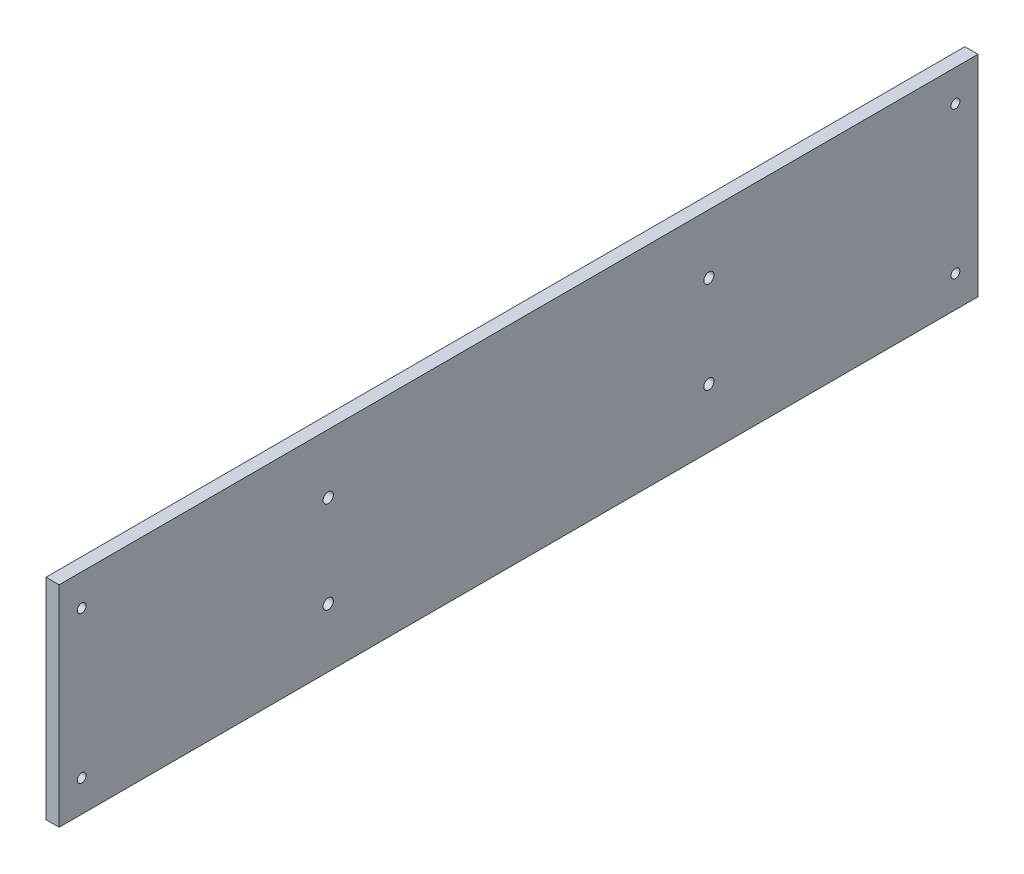
ISO-10303-21;
HEADER;
FILE_DESCRIPTION(('STEP AP214'),'2;1');
FILE_NAME('part.step','',(''),(''),'','','');
FILE_SCHEMA(('AUTOMOTIVE_DESIGN { 1 0 10303 214 1 1 1 1 }'));
ENDSEC;
DATA;
#1=APPLICATION_CONTEXT('core data for automotive mechanical design processes');
#2=APPLICATION_PROTOCOL_DEFINITION('international standard','automotive_design',2000,#1);
#3=PRODUCT_CONTEXT('',#1,'mechanical');
#4=PRODUCT('Part','Part','',(#3));
#5=PRODUCT_RELATED_PRODUCT_CATEGORY('part','',(#4));
#6=PRODUCT_DEFINITION_FORMATION('','',#4);
#7=PRODUCT_DEFINITION_CONTEXT('part definition',#1,'design');
#8=PRODUCT_DEFINITION('design','',#6,#7);
#9=PRODUCT_DEFINITION_SHAPE('','',#8);
#10=(LENGTH_UNIT() NAMED_UNIT(*) SI_UNIT(.MILLI.,.METRE.));
#11=(NAMED_UNIT(*) PLANE_ANGLE_UNIT() SI_UNIT($,.RADIAN.));
#12=(NAMED_UNIT(*) SI_UNIT($,.STERADIAN.) SOLID_ANGLE_UNIT());
#13=UNCERTAINTY_MEASURE_WITH_UNIT(LENGTH_MEASURE(1.E-05),#10,'distance_accuracy_value','');
#14=(GEOMETRIC_REPRESENTATION_CONTEXT(3) GLOBAL_UNCERTAINTY_ASSIGNED_CONTEXT((#13)) GLOBAL_UNIT_ASSIGNED_CONTEXT((#10,
#11,#12)) REPRESENTATION_CONTEXT('',''));
#15=CARTESIAN_POINT('',(0.,0.,0.));
#16=DIRECTION('',(0.,0.,1.));
#17=DIRECTION('',(1.,0.,0.));
#18=AXIS2_PLACEMENT_3D('',#15,#16,#17);
#19=CARTESIAN_POINT('',(6.35,50.8,-222.25));
#20=DIRECTION('',(0.,0.,1.));
#21=DIRECTION('',(1.,0.,0.));
#22=AXIS2_PLACEMENT_3D('',#19,#20,#21);
#23=PLANE('',#22);
#24=DIRECTION('',(0.,1.,0.));
#25=VECTOR('',#24,1.);
#26=CARTESIAN_POINT('',(0.,50.8,-222.25));
#27=LINE('',#26,#25);
#28=CARTESIAN_POINT('',(0.,-50.8,-222.25));
#29=VERTEX_POINT('',#28);
#30=CARTESIAN_POINT('',(0.,50.8,-222.25));
#31=VERTEX_POINT('',#30);
#32=EDGE_CURVE('E100',#29,#31,#27,.T.);
#33=ORIENTED_EDGE('',*,*,#32,.T.);
#34=DIRECTION('',(-1.,0.,0.));
#35=VECTOR('',#34,1.);
#36=CARTESIAN_POINT('',(6.35,50.8,-222.25));
#37=LINE('',#36,#35);
#38=CARTESIAN_POINT('',(6.35,50.8,-222.25));
#39=VERTEX_POINT('',#38);
#40=EDGE_CURVE('E11',#39,#31,#37,.T.);
#41=ORIENTED_EDGE('',*,*,#40,.F.);
#42=DIRECTION('',(0.,1.,0.));
#43=VECTOR('',#42,1.);
#44=CARTESIAN_POINT('',(6.35,50.8,-222.25));
#45=LINE('',#44,#43);
#46=CARTESIAN_POINT('',(6.35,-50.8,-222.25));
#47=VERTEX_POINT('',#46);
#48=EDGE_CURVE('E88',#47,#39,#45,.T.);
#49=ORIENTED_EDGE('',*,*,#48,.F.);
#50=DIRECTION('',(-1.,0.,0.));
#51=VECTOR('',#50,1.);
#52=CARTESIAN_POINT('',(6.35,-50.8,-222.25));
#53=LINE('',#52,#51);
#54=EDGE_CURVE('E96',#47,#29,#53,.T.);
#55=ORIENTED_EDGE('',*,*,#54,.T.);
#56=EDGE_LOOP('',(#33,#41,#49,#55));
#57=FACE_BOUND('',#56,.T.);
#58=ADVANCED_FACE('F37',(#57),#23,.F.);
#59=CARTESIAN_POINT('',(6.35,50.8,222.25));
#60=DIRECTION('',(0.,-1.,0.));
#61=DIRECTION('',(0.,0.,-1.));
#62=AXIS2_PLACEMENT_3D('',#59,#60,#61);
#63=PLANE('',#62);
#64=DIRECTION('',(0.,0.,1.));
#65=VECTOR('',#64,1.);
#66=CARTESIAN_POINT('',(0.,50.8,222.25));
#67=LINE('',#66,#65);
#68=CARTESIAN_POINT('',(0.,50.8,222.25));
#69=VERTEX_POINT('',#68);
#70=EDGE_CURVE('E92',#31,#69,#67,.T.);
#71=ORIENTED_EDGE('',*,*,#70,.T.);
#72=DIRECTION('',(-1.,0.,0.));
#73=VECTOR('',#72,1.);
#74=CARTESIAN_POINT('',(6.35,50.8,222.25));
#75=LINE('',#74,#73);
#76=CARTESIAN_POINT('',(6.35,50.8,222.25));
#77=VERTEX_POINT('',#76);
#78=EDGE_CURVE('E45',#77,#69,#75,.T.);
#79=ORIENTED_EDGE('',*,*,#78,.F.);
#80=DIRECTION('',(0.,0.,1.));
#81=VECTOR('',#80,1.);
#82=CARTESIAN_POINT('',(6.35,50.8,222.25));
#83=LINE('',#82,#81);
#84=EDGE_CURVE('E83',#39,#77,#83,.T.);
#85=ORIENTED_EDGE('',*,*,#84,.F.);
#86=ORIENTED_EDGE('',*,*,#40,.T.);
#87=EDGE_LOOP('',(#71,#79,#85,#86));
#88=FACE_BOUND('',#87,.T.);
#89=ADVANCED_FACE('F91',(#88),#63,.F.);
#90=CARTESIAN_POINT('',(6.35,50.8,222.25));
#91=DIRECTION('',(0.,0.,-1.));
#92=DIRECTION('',(-1.,0.,0.));
#93=AXIS2_PLACEMENT_3D('',#90,#91,#92);
#94=PLANE('',#93);
#95=DIRECTION('',(0.,-1.,0.));
#96=VECTOR('',#95,1.);
#97=CARTESIAN_POINT('',(0.,50.8,222.25));
#98=LINE('',#97,#96);
#99=CARTESIAN_POINT('',(0.,-50.8,222.25));
#100=VERTEX_POINT('',#99);
#101=EDGE_CURVE('E70',#69,#100,#98,.T.);
#102=ORIENTED_EDGE('',*,*,#101,.T.);
#103=DIRECTION('',(-1.,0.,0.));
#104=VECTOR('',#103,1.);
#105=CARTESIAN_POINT('',(6.35,-50.8,222.25));
#106=LINE('',#105,#104);
#107=CARTESIAN_POINT('',(6.35,-50.8,222.25));
#108=VERTEX_POINT('',#107);
#109=EDGE_CURVE('E93',#108,#100,#106,.T.);
#110=ORIENTED_EDGE('',*,*,#109,.F.);
#111=DIRECTION('',(0.,-1.,0.));
#112=VECTOR('',#111,1.);
#113=CARTESIAN_POINT('',(6.35,50.8,222.25));
#114=LINE('',#113,#112);
#115=EDGE_CURVE('E86',#77,#108,#114,.T.);
#116=ORIENTED_EDGE('',*,*,#115,.F.);
#117=ORIENTED_EDGE('',*,*,#78,.T.);
#118=EDGE_LOOP('',(#102,#110,#116,#117));
#119=FACE_BOUND('',#118,.T.);
#120=ADVANCED_FACE('F94',(#119),#94,.F.);
#121=CARTESIAN_POINT('',(6.35,-50.8,222.25));
#122=DIRECTION('',(0.,1.,0.));
#123=DIRECTION('',(0.,0.,1.));
#124=AXIS2_PLACEMENT_3D('',#121,#122,#123);
#125=PLANE('',#124);
#126=DIRECTION('',(0.,0.,-1.));
#127=VECTOR('',#126,1.);
#128=CARTESIAN_POINT('',(0.,-50.8,222.25));
#129=LINE('',#128,#127);
#130=EDGE_CURVE('E76',#100,#29,#129,.T.);
#131=ORIENTED_EDGE('',*,*,#130,.T.);
#132=ORIENTED_EDGE('',*,*,#54,.F.);
#133=DIRECTION('',(0.,0.,-1.));
#134=VECTOR('',#133,1.);
#135=CARTESIAN_POINT('',(6.35,-50.8,222.25));
#136=LINE('',#135,#134);
#137=EDGE_CURVE('E53',#108,#47,#136,.T.);
#138=ORIENTED_EDGE('',*,*,#137,.F.);
#139=ORIENTED_EDGE('',*,*,#109,.T.);
#140=EDGE_LOOP('',(#131,#132,#138,#139));
#141=FACE_BOUND('',#140,.T.);
#142=ADVANCED_FACE('F108',(#141),#125,.F.);
#143=CARTESIAN_POINT('',(6.35,0.,0.));
#144=DIRECTION('',(1.,0.,0.));
#145=DIRECTION('',(0.,0.,-1.));
#146=AXIS2_PLACEMENT_3D('',#143,#144,#145);
#147=PLANE('',#146);
#148=CARTESIAN_POINT('',(6.35,35.56,211.328));
#149=DIRECTION('',(1.,0.,0.));
#150=DIRECTION('',(0.,0.,-1.));
#151=AXIS2_PLACEMENT_3D('',#148,#149,#150);
#152=CIRCLE('',#151,2.15265);
#153=CARTESIAN_POINT('',(6.35,35.56,209.17535));
#154=VERTEX_POINT('',#153);
#155=EDGE_CURVE('E158',#154,#154,#152,.T.);
#156=ORIENTED_EDGE('',*,*,#155,.F.);
#157=EDGE_LOOP('',(#156));
#158=FACE_BOUND('',#157,.T.);
#159=CARTESIAN_POINT('',(6.35,-35.56,211.328));
#160=DIRECTION('',(1.,0.,0.));
#161=DIRECTION('',(0.,0.,-1.));
#162=AXIS2_PLACEMENT_3D('',#159,#160,#161);
#163=CIRCLE('',#162,2.15265);
#164=CARTESIAN_POINT('',(6.35,-35.56,209.17535));
#165=VERTEX_POINT('',#164);
#166=EDGE_CURVE('E152',#165,#165,#163,.T.);
#167=ORIENTED_EDGE('',*,*,#166,.F.);
#168=EDGE_LOOP('',(#167));
#169=FACE_BOUND('',#168,.T.);
#170=CARTESIAN_POINT('',(6.35,-35.56,-211.328));
#171=DIRECTION('',(1.,0.,0.));
#172=DIRECTION('',(0.,0.,-1.));
#173=AXIS2_PLACEMENT_3D('',#170,#171,#172);
#174=CIRCLE('',#173,2.15265);
#175=CARTESIAN_POINT('',(6.35,-35.56,-213.48065));
#176=VERTEX_POINT('',#175);
#177=EDGE_CURVE('E146',#176,#176,#174,.T.);
#178=ORIENTED_EDGE('',*,*,#177,.F.);
#179=EDGE_LOOP('',(#178));
#180=FACE_BOUND('',#179,.T.);
#181=CARTESIAN_POINT('',(6.35,35.56,-211.328));
#182=DIRECTION('',(1.,0.,0.));
#183=DIRECTION('',(0.,0.,-1.));
#184=AXIS2_PLACEMENT_3D('',#181,#182,#183);
#185=CIRCLE('',#184,2.15265);
#186=CARTESIAN_POINT('',(6.35,35.56,-213.48065));
#187=VERTEX_POINT('',#186);
#188=EDGE_CURVE('E140',#187,#187,#185,.T.);
#189=ORIENTED_EDGE('',*,*,#188,.F.);
#190=EDGE_LOOP('',(#189));
#191=FACE_BOUND('',#190,.T.);
#192=CARTESIAN_POINT('',(6.35,22.225,-92.075));
#193=DIRECTION('',(1.,0.,0.));
#194=DIRECTION('',(0.,0.,-1.));
#195=AXIS2_PLACEMENT_3D('',#192,#193,#194);
#196=CIRCLE('',#195,2.48919999999999);
#197=CARTESIAN_POINT('',(6.35,22.225,-94.5642));
#198=VERTEX_POINT('',#197);
#199=EDGE_CURVE('E134',#198,#198,#196,.T.);
#200=ORIENTED_EDGE('',*,*,#199,.F.);
#201=EDGE_LOOP('',(#200));
#202=FACE_BOUND('',#201,.T.);
#203=CARTESIAN_POINT('',(6.35,-22.225,-92.075));
#204=DIRECTION('',(1.,0.,0.));
#205=DIRECTION('',(0.,0.,-1.));
#206=AXIS2_PLACEMENT_3D('',#203,#204,#205);
#207=CIRCLE('',#206,2.48919999999999);
#208=CARTESIAN_POINT('',(6.35,-22.225,-94.5642));
#209=VERTEX_POINT('',#208);
#210=EDGE_CURVE('E128',#209,#209,#207,.T.);
#211=ORIENTED_EDGE('',*,*,#210,.F.);
#212=EDGE_LOOP('',(#211));
#213=FACE_BOUND('',#212,.T.);
#214=CARTESIAN_POINT('',(6.35,22.225,92.075));
#215=DIRECTION('',(1.,0.,0.));
#216=DIRECTION('',(0.,0.,-1.));
#217=AXIS2_PLACEMENT_3D('',#214,#215,#216);
#218=CIRCLE('',#217,2.48919999999999);
#219=CARTESIAN_POINT('',(6.35,22.225,89.5858));
#220=VERTEX_POINT('',#219);
#221=EDGE_CURVE('E122',#220,#220,#218,.T.);
#222=ORIENTED_EDGE('',*,*,#221,.F.);
#223=EDGE_LOOP('',(#222));
#224=FACE_BOUND('',#223,.T.);
#225=CARTESIAN_POINT('',(6.35,-22.225,92.075));
#226=DIRECTION('',(1.,0.,0.));
#227=DIRECTION('',(0.,0.,-1.));
#228=AXIS2_PLACEMENT_3D('',#225,#226,#227);
#229=CIRCLE('',#228,2.48919999999999);
#230=CARTESIAN_POINT('',(6.35,-22.225,89.5858));
#231=VERTEX_POINT('',#230);
#232=EDGE_CURVE('E116',#231,#231,#229,.T.);
#233=ORIENTED_EDGE('',*,*,#232,.F.);
#234=EDGE_LOOP('',(#233));
#235=FACE_BOUND('',#234,.T.);
#236=ORIENTED_EDGE('',*,*,#48,.T.);
#237=ORIENTED_EDGE('',*,*,#84,.T.);
#238=ORIENTED_EDGE('',*,*,#115,.T.);
#239=ORIENTED_EDGE('',*,*,#137,.T.);
#240=EDGE_LOOP('',(#236,#237,#238,#239));
#241=FACE_BOUND('',#240,.T.);
#242=ADVANCED_FACE('F84',(#158,#169,#180,#191,#202,#213,#224,#235,#241),#147,.T.);
#243=CARTESIAN_POINT('',(0.,0.,0.));
#244=DIRECTION('',(1.,0.,0.));
#245=DIRECTION('',(0.,0.,-1.));
#246=AXIS2_PLACEMENT_3D('',#243,#244,#245);
#247=PLANE('',#246);
#248=CARTESIAN_POINT('',(0.,35.56,211.328));
#249=DIRECTION('',(1.,0.,0.));
#250=DIRECTION('',(0.,0.,-1.));
#251=AXIS2_PLACEMENT_3D('',#248,#249,#250);
#252=CIRCLE('',#251,2.15265);
#253=CARTESIAN_POINT('',(0.,35.56,209.17535));
#254=VERTEX_POINT('',#253);
#255=EDGE_CURVE('E155',#254,#254,#252,.T.);
#256=ORIENTED_EDGE('',*,*,#255,.T.);
#257=EDGE_LOOP('',(#256));
#258=FACE_BOUND('',#257,.T.);
#259=CARTESIAN_POINT('',(0.,-35.56,211.328));
#260=DIRECTION('',(1.,0.,0.));
#261=DIRECTION('',(0.,0.,-1.));
#262=AXIS2_PLACEMENT_3D('',#259,#260,#261);
#263=CIRCLE('',#262,2.15265);
#264=CARTESIAN_POINT('',(0.,-35.56,209.17535));
#265=VERTEX_POINT('',#264);
#266=EDGE_CURVE('E149',#265,#265,#263,.T.);
#267=ORIENTED_EDGE('',*,*,#266,.T.);
#268=EDGE_LOOP('',(#267));
#269=FACE_BOUND('',#268,.T.);
#270=CARTESIAN_POINT('',(0.,-35.56,-211.328));
#271=DIRECTION('',(1.,0.,0.));
#272=DIRECTION('',(0.,0.,-1.));
#273=AXIS2_PLACEMENT_3D('',#270,#271,#272);
#274=CIRCLE('',#273,2.15265);
#275=CARTESIAN_POINT('',(0.,-35.56,-213.48065));
#276=VERTEX_POINT('',#275);
#277=EDGE_CURVE('E143',#276,#276,#274,.T.);
#278=ORIENTED_EDGE('',*,*,#277,.T.);
#279=EDGE_LOOP('',(#278));
#280=FACE_BOUND('',#279,.T.);
#281=CARTESIAN_POINT('',(0.,35.56,-211.328));
#282=DIRECTION('',(1.,0.,0.));
#283=DIRECTION('',(0.,0.,-1.));
#284=AXIS2_PLACEMENT_3D('',#281,#282,#283);
#285=CIRCLE('',#284,2.15265);
#286=CARTESIAN_POINT('',(0.,35.56,-213.48065));
#287=VERTEX_POINT('',#286);
#288=EDGE_CURVE('E137',#287,#287,#285,.T.);
#289=ORIENTED_EDGE('',*,*,#288,.T.);
#290=EDGE_LOOP('',(#289));
#291=FACE_BOUND('',#290,.T.);
#292=CARTESIAN_POINT('',(0.,22.225,-92.075));
#293=DIRECTION('',(1.,0.,0.));
#294=DIRECTION('',(0.,0.,-1.));
#295=AXIS2_PLACEMENT_3D('',#292,#293,#294);
#296=CIRCLE('',#295,2.48919999999999);
#297=CARTESIAN_POINT('',(0.,22.225,-94.5642));
#298=VERTEX_POINT('',#297);
#299=EDGE_CURVE('E131',#298,#298,#296,.T.);
#300=ORIENTED_EDGE('',*,*,#299,.T.);
#301=EDGE_LOOP('',(#300));
#302=FACE_BOUND('',#301,.T.);
#303=CARTESIAN_POINT('',(0.,-22.225,-92.075));
#304=DIRECTION('',(1.,0.,0.));
#305=DIRECTION('',(0.,0.,-1.));
#306=AXIS2_PLACEMENT_3D('',#303,#304,#305);
#307=CIRCLE('',#306,2.48919999999999);
#308=CARTESIAN_POINT('',(0.,-22.225,-94.5642));
#309=VERTEX_POINT('',#308);
#310=EDGE_CURVE('E125',#309,#309,#307,.T.);
#311=ORIENTED_EDGE('',*,*,#310,.T.);
#312=EDGE_LOOP('',(#311));
#313=FACE_BOUND('',#312,.T.);
#314=CARTESIAN_POINT('',(0.,22.225,92.075));
#315=DIRECTION('',(1.,0.,0.));
#316=DIRECTION('',(0.,0.,-1.));
#317=AXIS2_PLACEMENT_3D('',#314,#315,#316);
#318=CIRCLE('',#317,2.48919999999999);
#319=CARTESIAN_POINT('',(0.,22.225,89.5858));
#320=VERTEX_POINT('',#319);
#321=EDGE_CURVE('E119',#320,#320,#318,.T.);
#322=ORIENTED_EDGE('',*,*,#321,.T.);
#323=EDGE_LOOP('',(#322));
#324=FACE_BOUND('',#323,.T.);
#325=CARTESIAN_POINT('',(0.,-22.225,92.075));
#326=DIRECTION('',(1.,0.,0.));
#327=DIRECTION('',(0.,0.,-1.));
#328=AXIS2_PLACEMENT_3D('',#325,#326,#327);
#329=CIRCLE('',#328,2.48919999999999);
#330=CARTESIAN_POINT('',(0.,-22.225,89.5858));
#331=VERTEX_POINT('',#330);
#332=EDGE_CURVE('E103',#331,#331,#329,.T.);
#333=ORIENTED_EDGE('',*,*,#332,.T.);
#334=EDGE_LOOP('',(#333));
#335=FACE_BOUND('',#334,.T.);
#336=ORIENTED_EDGE('',*,*,#32,.F.);
#337=ORIENTED_EDGE('',*,*,#130,.F.);
#338=ORIENTED_EDGE('',*,*,#101,.F.);
#339=ORIENTED_EDGE('',*,*,#70,.F.);
#340=EDGE_LOOP('',(#336,#337,#338,#339));
#341=FACE_BOUND('',#340,.T.);
#342=ADVANCED_FACE('F111',(#258,#269,#280,#291,#302,#313,#324,#335,#341),#247,.F.);
#343=CARTESIAN_POINT('',(6.35,-22.225,92.075));
#344=DIRECTION('',(1.,0.,0.));
#345=DIRECTION('',(0.,0.,-1.));
#346=AXIS2_PLACEMENT_3D('',#343,#344,#345);
#347=CYLINDRICAL_SURFACE('',#346,2.48919999999999);
#348=ORIENTED_EDGE('',*,*,#332,.F.);
#349=EDGE_LOOP('',(#348));
#350=FACE_BOUND('',#349,.T.);
#351=ORIENTED_EDGE('',*,*,#232,.T.);
#352=EDGE_LOOP('',(#351));
#353=FACE_BOUND('',#352,.T.);
#354=ADVANCED_FACE('F181',(#350,#353),#347,.F.);
#355=CARTESIAN_POINT('',(6.35,22.225,92.075));
#356=DIRECTION('',(1.,0.,0.));
#357=DIRECTION('',(0.,0.,-1.));
#358=AXIS2_PLACEMENT_3D('',#355,#356,#357);
#359=CYLINDRICAL_SURFACE('',#358,2.48919999999999);
#360=ORIENTED_EDGE('',*,*,#321,.F.);
#361=EDGE_LOOP('',(#360));
#362=FACE_BOUND('',#361,.T.);
#363=ORIENTED_EDGE('',*,*,#221,.T.);
#364=EDGE_LOOP('',(#363));
#365=FACE_BOUND('',#364,.T.);
#366=ADVANCED_FACE('F183',(#362,#365),#359,.F.);
#367=CARTESIAN_POINT('',(6.35,-22.225,-92.075));
#368=DIRECTION('',(1.,0.,0.));
#369=DIRECTION('',(0.,0.,-1.));
#370=AXIS2_PLACEMENT_3D('',#367,#368,#369);
#371=CYLINDRICAL_SURFACE('',#370,2.48919999999999);
#372=ORIENTED_EDGE('',*,*,#310,.F.);
#373=EDGE_LOOP('',(#372));
#374=FACE_BOUND('',#373,.T.);
#375=ORIENTED_EDGE('',*,*,#210,.T.);
#376=EDGE_LOOP('',(#375));
#377=FACE_BOUND('',#376,.T.);
#378=ADVANCED_FACE('F190',(#374,#377),#371,.F.);
#379=CARTESIAN_POINT('',(6.35,22.225,-92.075));
#380=DIRECTION('',(1.,0.,0.));
#381=DIRECTION('',(0.,0.,-1.));
#382=AXIS2_PLACEMENT_3D('',#379,#380,#381);
#383=CYLINDRICAL_SURFACE('',#382,2.48919999999999);
#384=ORIENTED_EDGE('',*,*,#299,.F.);
#385=EDGE_LOOP('',(#384));
#386=FACE_BOUND('',#385,.T.);
#387=ORIENTED_EDGE('',*,*,#199,.T.);
#388=EDGE_LOOP('',(#387));
#389=FACE_BOUND('',#388,.T.);
#390=ADVANCED_FACE('F232',(#386,#389),#383,.F.);
#391=CARTESIAN_POINT('',(6.35,35.56,-211.328));
#392=DIRECTION('',(1.,0.,0.));
#393=DIRECTION('',(0.,0.,-1.));
#394=AXIS2_PLACEMENT_3D('',#391,#392,#393);
#395=CYLINDRICAL_SURFACE('',#394,2.15265);
#396=ORIENTED_EDGE('',*,*,#288,.F.);
#397=EDGE_LOOP('',(#396));
#398=FACE_BOUND('',#397,.T.);
#399=ORIENTED_EDGE('',*,*,#188,.T.);
#400=EDGE_LOOP('',(#399));
#401=FACE_BOUND('',#400,.T.);
#402=ADVANCED_FACE('F226',(#398,#401),#395,.F.);
#403=CARTESIAN_POINT('',(6.35,-35.56,-211.328));
#404=DIRECTION('',(1.,0.,0.));
#405=DIRECTION('',(0.,0.,-1.));
#406=AXIS2_PLACEMENT_3D('',#403,#404,#405);
#407=CYLINDRICAL_SURFACE('',#406,2.15265);
#408=ORIENTED_EDGE('',*,*,#277,.F.);
#409=EDGE_LOOP('',(#408));
#410=FACE_BOUND('',#409,.T.);
#411=ORIENTED_EDGE('',*,*,#177,.T.);
#412=EDGE_LOOP('',(#411));
#413=FACE_BOUND('',#412,.T.);
#414=ADVANCED_FACE('F231',(#410,#413),#407,.F.);
#415=CARTESIAN_POINT('',(6.35,-35.56,211.328));
#416=DIRECTION('',(1.,0.,0.));
#417=DIRECTION('',(0.,0.,-1.));
#418=AXIS2_PLACEMENT_3D('',#415,#416,#417);
#419=CYLINDRICAL_SURFACE('',#418,2.15265);
#420=ORIENTED_EDGE('',*,*,#266,.F.);
#421=EDGE_LOOP('',(#420));
#422=FACE_BOUND('',#421,.T.);
#423=ORIENTED_EDGE('',*,*,#166,.T.);
#424=EDGE_LOOP('',(#423));
#425=FACE_BOUND('',#424,.T.);
#426=ADVANCED_FACE('F245',(#422,#425),#419,.F.);
#427=CARTESIAN_POINT('',(6.35,35.56,211.328));
#428=DIRECTION('',(1.,0.,0.));
#429=DIRECTION('',(0.,0.,-1.));
#430=AXIS2_PLACEMENT_3D('',#427,#428,#429);
#431=CYLINDRICAL_SURFACE('',#430,2.15265);
#432=ORIENTED_EDGE('',*,*,#255,.F.);
#433=EDGE_LOOP('',(#432));
#434=FACE_BOUND('',#433,.T.);
#435=ORIENTED_EDGE('',*,*,#155,.T.);
#436=EDGE_LOOP('',(#435));
#437=FACE_BOUND('',#436,.T.);
#438=ADVANCED_FACE('F162',(#434,#437),#431,.F.);
#439=CLOSED_SHELL('',(#58,#89,#120,#142,#242,#342,#354,#366,#378,#390,#402,#414,#426,#438));
#440=MANIFOLD_SOLID_BREP('B2',#439);
#441=ADVANCED_BREP_SHAPE_REPRESENTATION('',(#18,#440),#14);
#442=SHAPE_DEFINITION_REPRESENTATION(#9,#441);
ENDSEC;
END-ISO-10303-21;
